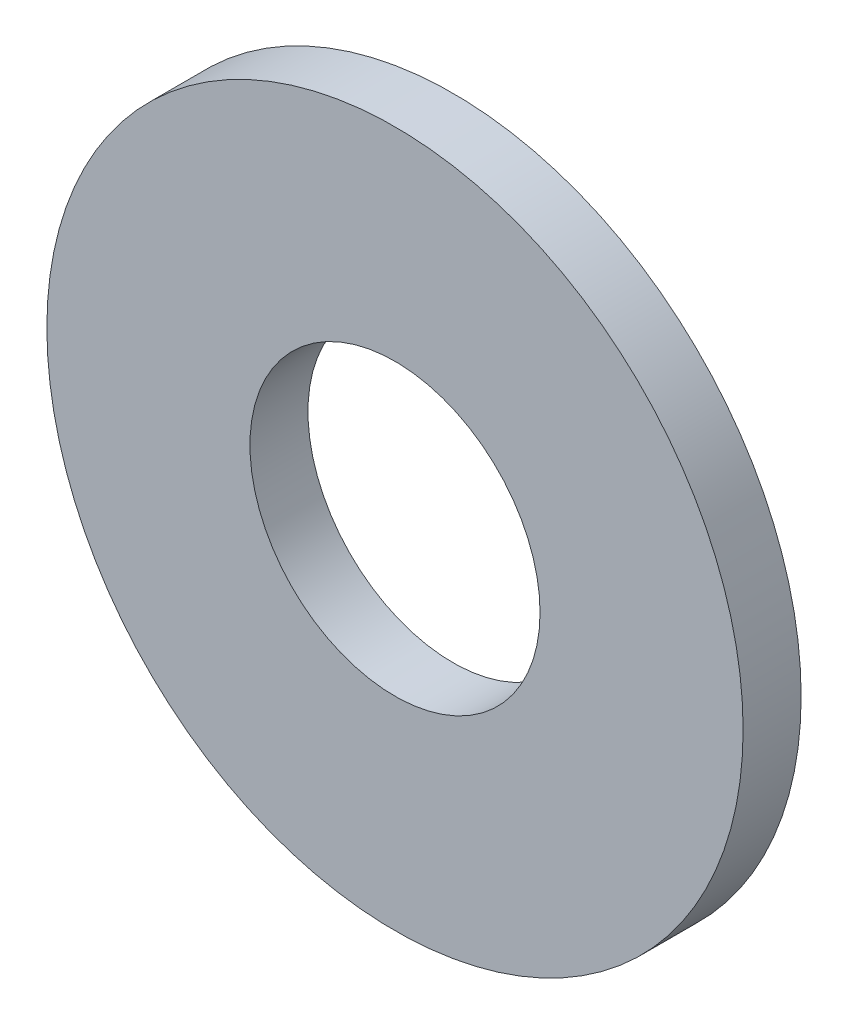
ISO-10303-21;
HEADER;
FILE_DESCRIPTION(('STEP AP214'),'2;1');
FILE_NAME('part.step','',(''),(''),'','','');
FILE_SCHEMA(('AUTOMOTIVE_DESIGN { 1 0 10303 214 1 1 1 1 }'));
ENDSEC;
DATA;
#1=APPLICATION_CONTEXT('core data for automotive mechanical design processes');
#2=APPLICATION_PROTOCOL_DEFINITION('international standard','automotive_design',2000,#1);
#3=PRODUCT_CONTEXT('',#1,'mechanical');
#4=PRODUCT('Part','Part','',(#3));
#5=PRODUCT_RELATED_PRODUCT_CATEGORY('part','',(#4));
#6=PRODUCT_DEFINITION_FORMATION('','',#4);
#7=PRODUCT_DEFINITION_CONTEXT('part definition',#1,'design');
#8=PRODUCT_DEFINITION('design','',#6,#7);
#9=PRODUCT_DEFINITION_SHAPE('','',#8);
#10=(LENGTH_UNIT() NAMED_UNIT(*) SI_UNIT(.MILLI.,.METRE.));
#11=(NAMED_UNIT(*) PLANE_ANGLE_UNIT() SI_UNIT($,.RADIAN.));
#12=(NAMED_UNIT(*) SI_UNIT($,.STERADIAN.) SOLID_ANGLE_UNIT());
#13=UNCERTAINTY_MEASURE_WITH_UNIT(LENGTH_MEASURE(1.E-05),#10,'distance_accuracy_value','');
#14=(GEOMETRIC_REPRESENTATION_CONTEXT(3) GLOBAL_UNCERTAINTY_ASSIGNED_CONTEXT((#13)) GLOBAL_UNIT_ASSIGNED_CONTEXT((#10,
#11,#12)) REPRESENTATION_CONTEXT('',''));
#15=CARTESIAN_POINT('',(0.,0.,0.));
#16=DIRECTION('',(0.,0.,1.));
#17=DIRECTION('',(1.,0.,0.));
#18=AXIS2_PLACEMENT_3D('',#15,#16,#17);
#19=CARTESIAN_POINT('',(0.,0.,1.));
#20=DIRECTION('',(0.,0.,1.));
#21=DIRECTION('',(1.,0.,0.));
#22=AXIS2_PLACEMENT_3D('',#19,#20,#21);
#23=PLANE('',#22);
#24=CARTESIAN_POINT('',(0.,0.,1.));
#25=DIRECTION('',(0.,0.,1.));
#26=DIRECTION('',(1.,0.,0.));
#27=AXIS2_PLACEMENT_3D('',#24,#25,#26);
#28=CIRCLE('',#27,6.);
#29=CARTESIAN_POINT('',(6.,0.,1.));
#30=VERTEX_POINT('',#29);
#31=EDGE_CURVE('E10',#30,#30,#28,.T.);
#32=ORIENTED_EDGE('',*,*,#31,.T.);
#33=EDGE_LOOP('',(#32));
#34=FACE_BOUND('',#33,.T.);
#35=CARTESIAN_POINT('',(0.,0.,1.));
#36=DIRECTION('',(0.,0.,1.));
#37=DIRECTION('',(1.,0.,0.));
#38=AXIS2_PLACEMENT_3D('',#35,#36,#37);
#39=CIRCLE('',#38,2.5);
#40=CARTESIAN_POINT('',(2.5,0.,1.));
#41=VERTEX_POINT('',#40);
#42=EDGE_CURVE('E45',#41,#41,#39,.T.);
#43=ORIENTED_EDGE('',*,*,#42,.F.);
#44=EDGE_LOOP('',(#43));
#45=FACE_BOUND('',#44,.T.);
#46=ADVANCED_FACE('F34',(#34,#45),#23,.T.);
#47=CARTESIAN_POINT('',(0.,0.,0.));
#48=DIRECTION('',(0.,0.,1.));
#49=DIRECTION('',(1.,0.,0.));
#50=AXIS2_PLACEMENT_3D('',#47,#48,#49);
#51=PLANE('',#50);
#52=CARTESIAN_POINT('',(0.,0.,0.));
#53=DIRECTION('',(0.,0.,1.));
#54=DIRECTION('',(1.,0.,0.));
#55=AXIS2_PLACEMENT_3D('',#52,#53,#54);
#56=CIRCLE('',#55,6.);
#57=CARTESIAN_POINT('',(6.,0.,0.));
#58=VERTEX_POINT('',#57);
#59=EDGE_CURVE('E38',#58,#58,#56,.T.);
#60=ORIENTED_EDGE('',*,*,#59,.F.);
#61=EDGE_LOOP('',(#60));
#62=FACE_BOUND('',#61,.T.);
#63=CARTESIAN_POINT('',(0.,0.,0.));
#64=DIRECTION('',(0.,0.,1.));
#65=DIRECTION('',(1.,0.,0.));
#66=AXIS2_PLACEMENT_3D('',#63,#64,#65);
#67=CIRCLE('',#66,2.5);
#68=CARTESIAN_POINT('',(2.5,0.,0.));
#69=VERTEX_POINT('',#68);
#70=EDGE_CURVE('E47',#69,#69,#67,.T.);
#71=ORIENTED_EDGE('',*,*,#70,.T.);
#72=EDGE_LOOP('',(#71));
#73=FACE_BOUND('',#72,.T.);
#74=ADVANCED_FACE('F57',(#62,#73),#51,.F.);
#75=CARTESIAN_POINT('',(0.,0.,1.));
#76=DIRECTION('',(0.,0.,-1.));
#77=DIRECTION('',(-1.,0.,0.));
#78=AXIS2_PLACEMENT_3D('',#75,#76,#77);
#79=CYLINDRICAL_SURFACE('',#78,6.);
#80=ORIENTED_EDGE('',*,*,#31,.F.);
#81=EDGE_LOOP('',(#80));
#82=FACE_BOUND('',#81,.T.);
#83=ORIENTED_EDGE('',*,*,#59,.T.);
#84=EDGE_LOOP('',(#83));
#85=FACE_BOUND('',#84,.T.);
#86=ADVANCED_FACE('F36',(#82,#85),#79,.T.);
#87=CARTESIAN_POINT('',(0.,0.,1.));
#88=DIRECTION('',(0.,0.,-1.));
#89=DIRECTION('',(-1.,0.,0.));
#90=AXIS2_PLACEMENT_3D('',#87,#88,#89);
#91=CYLINDRICAL_SURFACE('',#90,2.5);
#92=ORIENTED_EDGE('',*,*,#42,.T.);
#93=EDGE_LOOP('',(#92));
#94=FACE_BOUND('',#93,.T.);
#95=ORIENTED_EDGE('',*,*,#70,.F.);
#96=EDGE_LOOP('',(#95));
#97=FACE_BOUND('',#96,.T.);
#98=ADVANCED_FACE('F53',(#94,#97),#91,.F.);
#99=CLOSED_SHELL('',(#46,#74,#86,#98));
#100=MANIFOLD_SOLID_BREP('B2',#99);
#101=ADVANCED_BREP_SHAPE_REPRESENTATION('',(#18,#100),#14);
#102=SHAPE_DEFINITION_REPRESENTATION(#9,#101);
ENDSEC;
END-ISO-10303-21;
